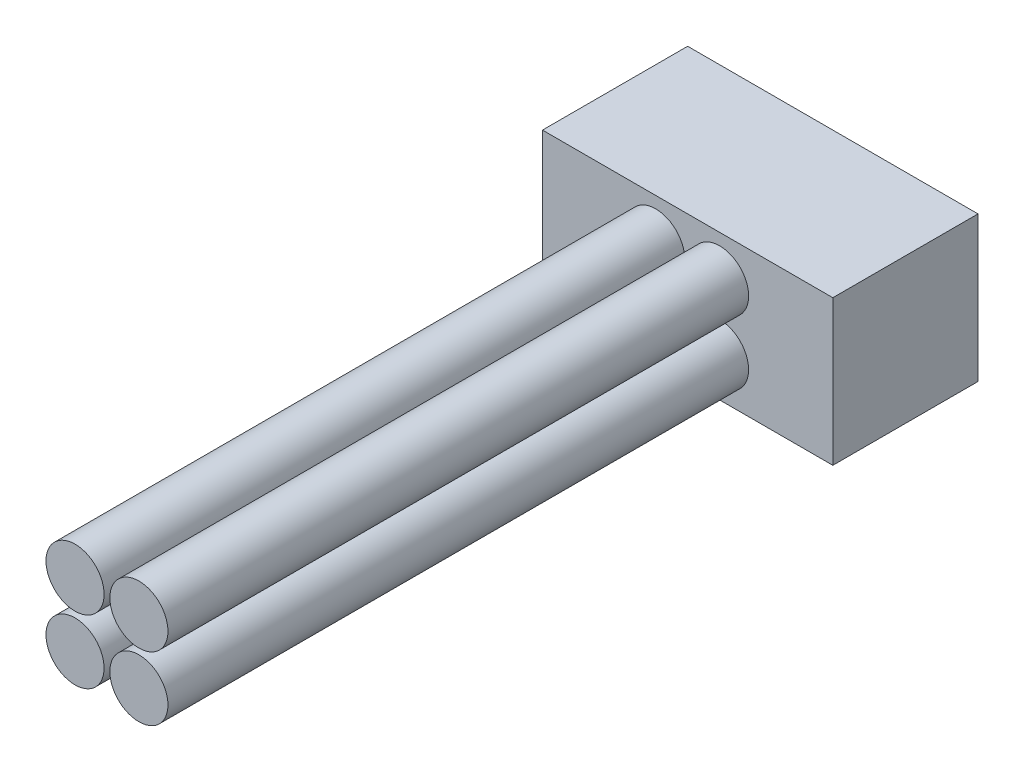
ISO-10303-21;
HEADER;
FILE_DESCRIPTION(('STEP AP214'),'2;1');
FILE_NAME('part.step','',(''),(''),'','','');
FILE_SCHEMA(('AUTOMOTIVE_DESIGN { 1 0 10303 214 1 1 1 1 }'));
ENDSEC;
DATA;
#1=APPLICATION_CONTEXT('core data for automotive mechanical design processes');
#2=APPLICATION_PROTOCOL_DEFINITION('international standard','automotive_design',2000,#1);
#3=PRODUCT_CONTEXT('',#1,'mechanical');
#4=PRODUCT('Part','Part','',(#3));
#5=PRODUCT_RELATED_PRODUCT_CATEGORY('part','',(#4));
#6=PRODUCT_DEFINITION_FORMATION('','',#4);
#7=PRODUCT_DEFINITION_CONTEXT('part definition',#1,'design');
#8=PRODUCT_DEFINITION('design','',#6,#7);
#9=PRODUCT_DEFINITION_SHAPE('','',#8);
#10=(LENGTH_UNIT() NAMED_UNIT(*) SI_UNIT(.MILLI.,.METRE.));
#11=(NAMED_UNIT(*) PLANE_ANGLE_UNIT() SI_UNIT($,.RADIAN.));
#12=(NAMED_UNIT(*) SI_UNIT($,.STERADIAN.) SOLID_ANGLE_UNIT());
#13=UNCERTAINTY_MEASURE_WITH_UNIT(LENGTH_MEASURE(1.E-05),#10,'distance_accuracy_value','');
#14=(GEOMETRIC_REPRESENTATION_CONTEXT(3) GLOBAL_UNCERTAINTY_ASSIGNED_CONTEXT((#13)) GLOBAL_UNIT_ASSIGNED_CONTEXT((#10,
#11,#12)) REPRESENTATION_CONTEXT('',''));
#15=CARTESIAN_POINT('',(0.,0.,0.));
#16=DIRECTION('',(0.,0.,1.));
#17=DIRECTION('',(1.,0.,0.));
#18=AXIS2_PLACEMENT_3D('',#15,#16,#17);
#19=CARTESIAN_POINT('',(0.,5.,5.));
#20=DIRECTION('',(0.,0.,-1.));
#21=DIRECTION('',(-1.,0.,0.));
#22=AXIS2_PLACEMENT_3D('',#19,#20,#21);
#23=PLANE('',#22);
#24=CARTESIAN_POINT('',(3.9,1.4,5.));
#25=DIRECTION('',(0.,0.,-1.));
#26=DIRECTION('',(-1.,0.,0.));
#27=AXIS2_PLACEMENT_3D('',#24,#25,#26);
#28=CIRCLE('',#27,1.);
#29=CARTESIAN_POINT('',(2.9,1.4,5.));
#30=VERTEX_POINT('',#29);
#31=EDGE_CURVE('E46',#30,#30,#28,.F.);
#32=ORIENTED_EDGE('',*,*,#31,.F.);
#33=EDGE_LOOP('',(#32));
#34=FACE_BOUND('',#33,.T.);
#35=CARTESIAN_POINT('',(3.9,3.6,5.));
#36=DIRECTION('',(0.,0.,-1.));
#37=DIRECTION('',(-1.,0.,0.));
#38=AXIS2_PLACEMENT_3D('',#35,#36,#37);
#39=CIRCLE('',#38,1.);
#40=CARTESIAN_POINT('',(2.9,3.6,5.));
#41=VERTEX_POINT('',#40);
#42=EDGE_CURVE('E115',#41,#41,#39,.F.);
#43=ORIENTED_EDGE('',*,*,#42,.F.);
#44=EDGE_LOOP('',(#43));
#45=FACE_BOUND('',#44,.T.);
#46=DIRECTION('',(0.,-1.,0.));
#47=VECTOR('',#46,1.);
#48=CARTESIAN_POINT('',(0.,0.,5.));
#49=LINE('',#48,#47);
#50=CARTESIAN_POINT('',(0.,5.,5.));
#51=VERTEX_POINT('',#50);
#52=CARTESIAN_POINT('',(0.,0.,5.));
#53=VERTEX_POINT('',#52);
#54=EDGE_CURVE('E90',#51,#53,#49,.T.);
#55=ORIENTED_EDGE('',*,*,#54,.T.);
#56=DIRECTION('',(1.,0.,0.));
#57=VECTOR('',#56,1.);
#58=CARTESIAN_POINT('',(0.,0.,5.));
#59=LINE('',#58,#57);
#60=CARTESIAN_POINT('',(10.,0.,5.));
#61=VERTEX_POINT('',#60);
#62=EDGE_CURVE('E85',#53,#61,#59,.T.);
#63=ORIENTED_EDGE('',*,*,#62,.T.);
#64=DIRECTION('',(0.,1.,0.));
#65=VECTOR('',#64,1.);
#66=CARTESIAN_POINT('',(10.,0.,5.));
#67=LINE('',#66,#65);
#68=CARTESIAN_POINT('',(10.,5.,5.));
#69=VERTEX_POINT('',#68);
#70=EDGE_CURVE('E88',#61,#69,#67,.T.);
#71=ORIENTED_EDGE('',*,*,#70,.T.);
#72=DIRECTION('',(-1.,0.,0.));
#73=VECTOR('',#72,1.);
#74=CARTESIAN_POINT('',(0.,5.,5.));
#75=LINE('',#74,#73);
#76=EDGE_CURVE('E54',#69,#51,#75,.T.);
#77=ORIENTED_EDGE('',*,*,#76,.T.);
#78=EDGE_LOOP('',(#55,#63,#71,#77));
#79=FACE_BOUND('',#78,.T.);
#80=CARTESIAN_POINT('',(6.1,3.6,5.));
#81=DIRECTION('',(0.,0.,-1.));
#82=DIRECTION('',(-1.,0.,0.));
#83=AXIS2_PLACEMENT_3D('',#80,#81,#82);
#84=CIRCLE('',#83,1.);
#85=CARTESIAN_POINT('',(5.1,3.6,5.));
#86=VERTEX_POINT('',#85);
#87=EDGE_CURVE('E118',#86,#86,#84,.F.);
#88=ORIENTED_EDGE('',*,*,#87,.F.);
#89=EDGE_LOOP('',(#88));
#90=FACE_BOUND('',#89,.T.);
#91=CARTESIAN_POINT('',(6.1,1.4,5.));
#92=DIRECTION('',(0.,0.,-1.));
#93=DIRECTION('',(-1.,0.,0.));
#94=AXIS2_PLACEMENT_3D('',#91,#92,#93);
#95=CIRCLE('',#94,1.);
#96=CARTESIAN_POINT('',(5.1,1.4,5.));
#97=VERTEX_POINT('',#96);
#98=EDGE_CURVE('E11',#97,#97,#95,.F.);
#99=ORIENTED_EDGE('',*,*,#98,.F.);
#100=EDGE_LOOP('',(#99));
#101=FACE_BOUND('',#100,.T.);
#102=ADVANCED_FACE('F37',(#34,#45,#79,#90,#101),#23,.F.);
#103=CARTESIAN_POINT('',(0.,0.,5.));
#104=DIRECTION('',(1.,0.,0.));
#105=DIRECTION('',(0.,0.,-1.));
#106=AXIS2_PLACEMENT_3D('',#103,#104,#105);
#107=PLANE('',#106);
#108=DIRECTION('',(0.,-1.,0.));
#109=VECTOR('',#108,1.);
#110=CARTESIAN_POINT('',(0.,0.,0.));
#111=LINE('',#110,#109);
#112=CARTESIAN_POINT('',(0.,5.,0.));
#113=VERTEX_POINT('',#112);
#114=CARTESIAN_POINT('',(0.,0.,0.));
#115=VERTEX_POINT('',#114);
#116=EDGE_CURVE('E105',#113,#115,#111,.T.);
#117=ORIENTED_EDGE('',*,*,#116,.T.);
#118=DIRECTION('',(0.,0.,-1.));
#119=VECTOR('',#118,1.);
#120=CARTESIAN_POINT('',(0.,0.,5.));
#121=LINE('',#120,#119);
#122=EDGE_CURVE('E96',#53,#115,#121,.T.);
#123=ORIENTED_EDGE('',*,*,#122,.F.);
#124=ORIENTED_EDGE('',*,*,#54,.F.);
#125=DIRECTION('',(0.,0.,-1.));
#126=VECTOR('',#125,1.);
#127=CARTESIAN_POINT('',(0.,5.,5.));
#128=LINE('',#127,#126);
#129=EDGE_CURVE('E101',#51,#113,#128,.T.);
#130=ORIENTED_EDGE('',*,*,#129,.T.);
#131=EDGE_LOOP('',(#117,#123,#124,#130));
#132=FACE_BOUND('',#131,.T.);
#133=ADVANCED_FACE('F39',(#132),#107,.F.);
#134=CARTESIAN_POINT('',(0.,0.,5.));
#135=DIRECTION('',(0.,1.,0.));
#136=DIRECTION('',(0.,0.,1.));
#137=AXIS2_PLACEMENT_3D('',#134,#135,#136);
#138=PLANE('',#137);
#139=DIRECTION('',(1.,0.,0.));
#140=VECTOR('',#139,1.);
#141=CARTESIAN_POINT('',(0.,0.,0.));
#142=LINE('',#141,#140);
#143=CARTESIAN_POINT('',(10.,0.,0.));
#144=VERTEX_POINT('',#143);
#145=EDGE_CURVE('E95',#115,#144,#142,.T.);
#146=ORIENTED_EDGE('',*,*,#145,.T.);
#147=DIRECTION('',(0.,0.,-1.));
#148=VECTOR('',#147,1.);
#149=CARTESIAN_POINT('',(10.,0.,5.));
#150=LINE('',#149,#148);
#151=EDGE_CURVE('E93',#61,#144,#150,.T.);
#152=ORIENTED_EDGE('',*,*,#151,.F.);
#153=ORIENTED_EDGE('',*,*,#62,.F.);
#154=ORIENTED_EDGE('',*,*,#122,.T.);
#155=EDGE_LOOP('',(#146,#152,#153,#154));
#156=FACE_BOUND('',#155,.T.);
#157=ADVANCED_FACE('F94',(#156),#138,.F.);
#158=CARTESIAN_POINT('',(10.,0.,5.));
#159=DIRECTION('',(-1.,0.,0.));
#160=DIRECTION('',(0.,0.,1.));
#161=AXIS2_PLACEMENT_3D('',#158,#159,#160);
#162=PLANE('',#161);
#163=DIRECTION('',(0.,1.,0.));
#164=VECTOR('',#163,1.);
#165=CARTESIAN_POINT('',(10.,0.,0.));
#166=LINE('',#165,#164);
#167=CARTESIAN_POINT('',(10.,5.,0.));
#168=VERTEX_POINT('',#167);
#169=EDGE_CURVE('E71',#144,#168,#166,.T.);
#170=ORIENTED_EDGE('',*,*,#169,.T.);
#171=DIRECTION('',(0.,0.,-1.));
#172=VECTOR('',#171,1.);
#173=CARTESIAN_POINT('',(10.,5.,5.));
#174=LINE('',#173,#172);
#175=EDGE_CURVE('E97',#69,#168,#174,.T.);
#176=ORIENTED_EDGE('',*,*,#175,.F.);
#177=ORIENTED_EDGE('',*,*,#70,.F.);
#178=ORIENTED_EDGE('',*,*,#151,.T.);
#179=EDGE_LOOP('',(#170,#176,#177,#178));
#180=FACE_BOUND('',#179,.T.);
#181=ADVANCED_FACE('F99',(#180),#162,.F.);
#182=CARTESIAN_POINT('',(0.,5.,5.));
#183=DIRECTION('',(0.,-1.,0.));
#184=DIRECTION('',(0.,0.,-1.));
#185=AXIS2_PLACEMENT_3D('',#182,#183,#184);
#186=PLANE('',#185);
#187=DIRECTION('',(-1.,0.,0.));
#188=VECTOR('',#187,1.);
#189=CARTESIAN_POINT('',(0.,5.,0.));
#190=LINE('',#189,#188);
#191=EDGE_CURVE('E77',#168,#113,#190,.T.);
#192=ORIENTED_EDGE('',*,*,#191,.T.);
#193=ORIENTED_EDGE('',*,*,#129,.F.);
#194=ORIENTED_EDGE('',*,*,#76,.F.);
#195=ORIENTED_EDGE('',*,*,#175,.T.);
#196=EDGE_LOOP('',(#192,#193,#194,#195));
#197=FACE_BOUND('',#196,.T.);
#198=ADVANCED_FACE('F143',(#197),#186,.F.);
#199=CARTESIAN_POINT('',(0.,5.,0.));
#200=DIRECTION('',(0.,0.,-1.));
#201=DIRECTION('',(-1.,0.,0.));
#202=AXIS2_PLACEMENT_3D('',#199,#200,#201);
#203=PLANE('',#202);
#204=ORIENTED_EDGE('',*,*,#116,.F.);
#205=ORIENTED_EDGE('',*,*,#191,.F.);
#206=ORIENTED_EDGE('',*,*,#169,.F.);
#207=ORIENTED_EDGE('',*,*,#145,.F.);
#208=EDGE_LOOP('',(#204,#205,#206,#207));
#209=FACE_BOUND('',#208,.T.);
#210=ADVANCED_FACE('F133',(#209),#203,.T.);
#211=CARTESIAN_POINT('',(3.9,3.6,25.));
#212=DIRECTION('',(0.,0.,-1.));
#213=DIRECTION('',(-1.,0.,0.));
#214=AXIS2_PLACEMENT_3D('',#211,#212,#213);
#215=CYLINDRICAL_SURFACE('',#214,1.);
#216=CARTESIAN_POINT('',(3.9,3.6,25.));
#217=DIRECTION('',(0.,0.,1.));
#218=DIRECTION('',(1.,0.,0.));
#219=AXIS2_PLACEMENT_3D('',#216,#217,#218);
#220=CIRCLE('',#219,1.);
#221=CARTESIAN_POINT('',(4.9,3.6,25.));
#222=VERTEX_POINT('',#221);
#223=EDGE_CURVE('E108',#222,#222,#220,.T.);
#224=ORIENTED_EDGE('',*,*,#223,.F.);
#225=EDGE_LOOP('',(#224));
#226=FACE_BOUND('',#225,.T.);
#227=ORIENTED_EDGE('',*,*,#42,.T.);
#228=EDGE_LOOP('',(#227));
#229=FACE_BOUND('',#228,.T.);
#230=ADVANCED_FACE('F130',(#226,#229),#215,.T.);
#231=CARTESIAN_POINT('',(5.,-6.33768492170035,25.));
#232=DIRECTION('',(0.,0.,1.));
#233=DIRECTION('',(1.,0.,0.));
#234=AXIS2_PLACEMENT_3D('',#231,#232,#233);
#235=PLANE('',#234);
#236=ORIENTED_EDGE('',*,*,#223,.T.);
#237=EDGE_LOOP('',(#236));
#238=FACE_BOUND('',#237,.T.);
#239=ADVANCED_FACE('F132',(#238),#235,.T.);
#240=CARTESIAN_POINT('',(6.1,3.6,25.));
#241=DIRECTION('',(0.,0.,-1.));
#242=DIRECTION('',(-1.,0.,0.));
#243=AXIS2_PLACEMENT_3D('',#240,#241,#242);
#244=CYLINDRICAL_SURFACE('',#243,1.);
#245=CARTESIAN_POINT('',(6.1,3.6,25.));
#246=DIRECTION('',(0.,0.,1.));
#247=DIRECTION('',(1.,0.,0.));
#248=AXIS2_PLACEMENT_3D('',#245,#246,#247);
#249=CIRCLE('',#248,1.);
#250=CARTESIAN_POINT('',(7.1,3.6,25.));
#251=VERTEX_POINT('',#250);
#252=EDGE_CURVE('E163',#251,#251,#249,.T.);
#253=ORIENTED_EDGE('',*,*,#252,.F.);
#254=EDGE_LOOP('',(#253));
#255=FACE_BOUND('',#254,.T.);
#256=ORIENTED_EDGE('',*,*,#87,.T.);
#257=EDGE_LOOP('',(#256));
#258=FACE_BOUND('',#257,.T.);
#259=ADVANCED_FACE('F140',(#255,#258),#244,.T.);
#260=CARTESIAN_POINT('',(5.,-6.33768492170035,25.));
#261=DIRECTION('',(0.,0.,1.));
#262=DIRECTION('',(1.,0.,0.));
#263=AXIS2_PLACEMENT_3D('',#260,#261,#262);
#264=PLANE('',#263);
#265=ORIENTED_EDGE('',*,*,#252,.T.);
#266=EDGE_LOOP('',(#265));
#267=FACE_BOUND('',#266,.T.);
#268=ADVANCED_FACE('F192',(#267),#264,.T.);
#269=CARTESIAN_POINT('',(3.9,1.4,25.));
#270=DIRECTION('',(0.,0.,-1.));
#271=DIRECTION('',(-1.,0.,0.));
#272=AXIS2_PLACEMENT_3D('',#269,#270,#271);
#273=CYLINDRICAL_SURFACE('',#272,1.);
#274=CARTESIAN_POINT('',(3.9,1.4,25.));
#275=DIRECTION('',(0.,0.,1.));
#276=DIRECTION('',(1.,0.,0.));
#277=AXIS2_PLACEMENT_3D('',#274,#275,#276);
#278=CIRCLE('',#277,1.);
#279=CARTESIAN_POINT('',(4.9,1.4,25.));
#280=VERTEX_POINT('',#279);
#281=EDGE_CURVE('E166',#280,#280,#278,.T.);
#282=ORIENTED_EDGE('',*,*,#281,.F.);
#283=EDGE_LOOP('',(#282));
#284=FACE_BOUND('',#283,.T.);
#285=ORIENTED_EDGE('',*,*,#31,.T.);
#286=EDGE_LOOP('',(#285));
#287=FACE_BOUND('',#286,.T.);
#288=ADVANCED_FACE('F123',(#284,#287),#273,.T.);
#289=CARTESIAN_POINT('',(5.,-6.33768492170035,25.));
#290=DIRECTION('',(0.,0.,1.));
#291=DIRECTION('',(1.,0.,0.));
#292=AXIS2_PLACEMENT_3D('',#289,#290,#291);
#293=PLANE('',#292);
#294=ORIENTED_EDGE('',*,*,#281,.T.);
#295=EDGE_LOOP('',(#294));
#296=FACE_BOUND('',#295,.T.);
#297=ADVANCED_FACE('F178',(#296),#293,.T.);
#298=CARTESIAN_POINT('',(6.1,1.4,25.));
#299=DIRECTION('',(0.,0.,-1.));
#300=DIRECTION('',(-1.,0.,0.));
#301=AXIS2_PLACEMENT_3D('',#298,#299,#300);
#302=CYLINDRICAL_SURFACE('',#301,1.);
#303=CARTESIAN_POINT('',(6.1,1.4,25.));
#304=DIRECTION('',(0.,0.,1.));
#305=DIRECTION('',(1.,0.,0.));
#306=AXIS2_PLACEMENT_3D('',#303,#304,#305);
#307=CIRCLE('',#306,1.);
#308=CARTESIAN_POINT('',(7.1,1.4,25.));
#309=VERTEX_POINT('',#308);
#310=EDGE_CURVE('E169',#309,#309,#307,.T.);
#311=ORIENTED_EDGE('',*,*,#310,.F.);
#312=EDGE_LOOP('',(#311));
#313=FACE_BOUND('',#312,.T.);
#314=ORIENTED_EDGE('',*,*,#98,.T.);
#315=EDGE_LOOP('',(#314));
#316=FACE_BOUND('',#315,.T.);
#317=ADVANCED_FACE('F175',(#313,#316),#302,.T.);
#318=CARTESIAN_POINT('',(5.,-6.33768492170035,25.));
#319=DIRECTION('',(0.,0.,1.));
#320=DIRECTION('',(1.,0.,0.));
#321=AXIS2_PLACEMENT_3D('',#318,#319,#320);
#322=PLANE('',#321);
#323=ORIENTED_EDGE('',*,*,#310,.T.);
#324=EDGE_LOOP('',(#323));
#325=FACE_BOUND('',#324,.T.);
#326=ADVANCED_FACE('F173',(#325),#322,.T.);
#327=CLOSED_SHELL('',(#102,#133,#157,#181,#198,#210,#230,#239,#259,#268,#288,#297,#317,#326));
#328=MANIFOLD_SOLID_BREP('B2',#327);
#329=ADVANCED_BREP_SHAPE_REPRESENTATION('',(#18,#328),#14);
#330=SHAPE_DEFINITION_REPRESENTATION(#9,#329);
ENDSEC;
END-ISO-10303-21;
